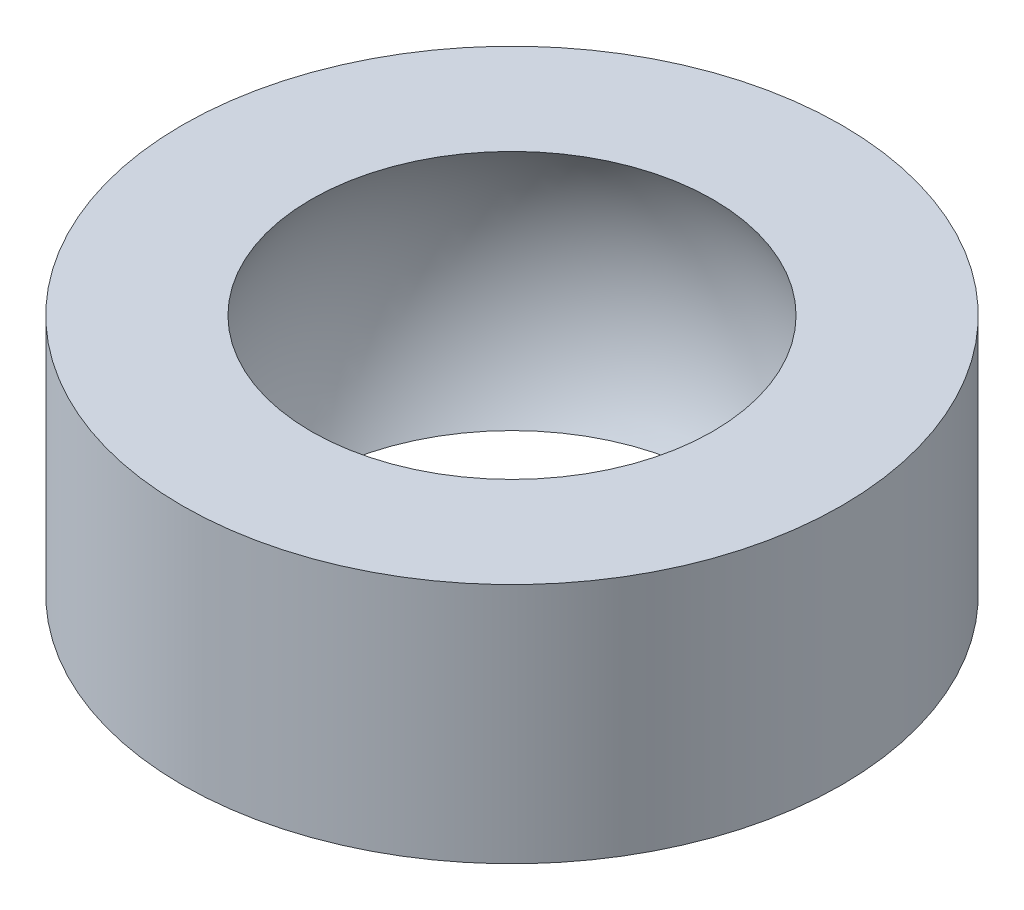
ISO-10303-21;
HEADER;
FILE_DESCRIPTION(('STEP AP214'),'2;1');
FILE_NAME('part.step','',(''),(''),'','','');
FILE_SCHEMA(('AUTOMOTIVE_DESIGN { 1 0 10303 214 1 1 1 1 }'));
ENDSEC;
DATA;
#1=APPLICATION_CONTEXT('core data for automotive mechanical design processes');
#2=APPLICATION_PROTOCOL_DEFINITION('international standard','automotive_design',2000,#1);
#3=PRODUCT_CONTEXT('',#1,'mechanical');
#4=PRODUCT('Part','Part','',(#3));
#5=PRODUCT_RELATED_PRODUCT_CATEGORY('part','',(#4));
#6=PRODUCT_DEFINITION_FORMATION('','',#4);
#7=PRODUCT_DEFINITION_CONTEXT('part definition',#1,'design');
#8=PRODUCT_DEFINITION('design','',#6,#7);
#9=PRODUCT_DEFINITION_SHAPE('','',#8);
#10=(LENGTH_UNIT() NAMED_UNIT(*) SI_UNIT(.MILLI.,.METRE.));
#11=(NAMED_UNIT(*) PLANE_ANGLE_UNIT() SI_UNIT($,.RADIAN.));
#12=(NAMED_UNIT(*) SI_UNIT($,.STERADIAN.) SOLID_ANGLE_UNIT());
#13=UNCERTAINTY_MEASURE_WITH_UNIT(LENGTH_MEASURE(1.E-05),#10,'distance_accuracy_value','');
#14=(GEOMETRIC_REPRESENTATION_CONTEXT(3) GLOBAL_UNCERTAINTY_ASSIGNED_CONTEXT((#13)) GLOBAL_UNIT_ASSIGNED_CONTEXT((#10,
#11,#12)) REPRESENTATION_CONTEXT('',''));
#15=CARTESIAN_POINT('',(0.,0.,0.));
#16=DIRECTION('',(0.,0.,1.));
#17=DIRECTION('',(1.,0.,0.));
#18=AXIS2_PLACEMENT_3D('',#15,#16,#17);
#19=CARTESIAN_POINT('',(0.,3.3,0.));
#20=DIRECTION('',(0.,-1.,0.));
#21=DIRECTION('',(0.,0.,-1.));
#22=AXIS2_PLACEMENT_3D('',#19,#20,#21);
#23=CYLINDRICAL_SURFACE('',#22,9.);
#24=CARTESIAN_POINT('',(0.,3.3,0.));
#25=DIRECTION('',(0.,1.,0.));
#26=DIRECTION('',(0.,0.,1.));
#27=AXIS2_PLACEMENT_3D('',#24,#25,#26);
#28=CIRCLE('',#27,9.);
#29=CARTESIAN_POINT('',(0.,3.3,9.));
#30=VERTEX_POINT('',#29);
#31=EDGE_CURVE('E10',#30,#30,#28,.T.);
#32=ORIENTED_EDGE('',*,*,#31,.F.);
#33=EDGE_LOOP('',(#32));
#34=FACE_BOUND('',#33,.T.);
#35=CARTESIAN_POINT('',(0.,-3.3,0.));
#36=DIRECTION('',(0.,1.,0.));
#37=DIRECTION('',(0.,0.,1.));
#38=AXIS2_PLACEMENT_3D('',#35,#36,#37);
#39=CIRCLE('',#38,9.);
#40=CARTESIAN_POINT('',(0.,-3.3,9.));
#41=VERTEX_POINT('',#40);
#42=EDGE_CURVE('E42',#41,#41,#39,.T.);
#43=ORIENTED_EDGE('',*,*,#42,.T.);
#44=EDGE_LOOP('',(#43));
#45=FACE_BOUND('',#44,.T.);
#46=ADVANCED_FACE('F35',(#34,#45),#23,.T.);
#47=CARTESIAN_POINT('',(0.,3.3,0.));
#48=DIRECTION('',(0.,1.,0.));
#49=DIRECTION('',(0.,0.,1.));
#50=AXIS2_PLACEMENT_3D('',#47,#48,#49);
#51=PLANE('',#50);
#52=CARTESIAN_POINT('',(0.,3.3,0.));
#53=DIRECTION('',(0.,1.,0.));
#54=DIRECTION('',(0.,0.,1.));
#55=AXIS2_PLACEMENT_3D('',#52,#53,#54);
#56=CIRCLE('',#55,5.48361194834208);
#57=CARTESIAN_POINT('',(-5.48361194834208,3.3,0.));
#58=VERTEX_POINT('',#57);
#59=EDGE_CURVE('E47',#58,#58,#56,.T.);
#60=ORIENTED_EDGE('',*,*,#59,.F.);
#61=EDGE_LOOP('',(#60));
#62=FACE_BOUND('',#61,.T.);
#63=ORIENTED_EDGE('',*,*,#31,.T.);
#64=EDGE_LOOP('',(#63));
#65=FACE_BOUND('',#64,.T.);
#66=ADVANCED_FACE('F64',(#62,#65),#51,.T.);
#67=CARTESIAN_POINT('',(0.,-3.3,0.));
#68=DIRECTION('',(0.,1.,0.));
#69=DIRECTION('',(0.,0.,1.));
#70=AXIS2_PLACEMENT_3D('',#67,#68,#69);
#71=PLANE('',#70);
#72=CARTESIAN_POINT('',(0.,-3.3,0.));
#73=DIRECTION('',(0.,1.,0.));
#74=DIRECTION('',(0.,0.,1.));
#75=AXIS2_PLACEMENT_3D('',#72,#73,#74);
#76=CIRCLE('',#75,5.48361194834208);
#77=CARTESIAN_POINT('',(-5.48361194834208,-3.3,0.));
#78=VERTEX_POINT('',#77);
#79=EDGE_CURVE('E38',#78,#78,#76,.T.);
#80=ORIENTED_EDGE('',*,*,#79,.T.);
#81=EDGE_LOOP('',(#80));
#82=FACE_BOUND('',#81,.T.);
#83=ORIENTED_EDGE('',*,*,#42,.F.);
#84=EDGE_LOOP('',(#83));
#85=FACE_BOUND('',#84,.T.);
#86=ADVANCED_FACE('F55',(#82,#85),#71,.F.);
#87=CARTESIAN_POINT('',(0.,0.,0.));
#88=DIRECTION('',(0.,-1.,0.));
#89=DIRECTION('',(-1.,0.,0.));
#90=AXIS2_PLACEMENT_3D('',#87,#88,#89);
#91=SPHERICAL_SURFACE('',#90,6.4);
#92=CARTESIAN_POINT('',(-5.48361194834208,3.3,0.));
#93=CARTESIAN_POINT('',(-5.52085680227095,3.23811118002439,0.));
#94=CARTESIAN_POINT('',(-5.55705305693094,3.17559135466294,0.));
#95=CARTESIAN_POINT('',(-5.62730880796052,3.04936243433516,0.));
#96=CARTESIAN_POINT('',(-5.66136830433011,2.98565333936883,0.));
#97=CARTESIAN_POINT('',(-5.72731097902626,2.85711862099805,0.));
#98=CARTESIAN_POINT('',(-5.75919415735283,2.79229299759362,0.));
#99=CARTESIAN_POINT('',(-5.82074778720863,2.66159960866351,0.));
#100=CARTESIAN_POINT('',(-5.85041823873786,2.59573184313784,0.));
#101=CARTESIAN_POINT('',(-5.90751236682131,2.46302965300479,0.));
#102=CARTESIAN_POINT('',(-5.93493604337552,2.39619522839741,0.));
#103=CARTESIAN_POINT('',(-5.98750519591282,2.26163633744056,0.));
#104=CARTESIAN_POINT('',(-6.0126506718959,2.19391187109109,0.));
#105=CARTESIAN_POINT('',(-6.06063459655309,2.05765052721056,0.));
#106=CARTESIAN_POINT('',(-6.08347304522721,1.9891136496795,0.));
#107=CARTESIAN_POINT('',(-6.12681673643974,1.85130604714006,0.));
#108=CARTESIAN_POINT('',(-6.14732197897817,1.78203532213169,0.));
#109=CARTESIAN_POINT('',(-6.18597575272273,1.64283942904118,0.));
#110=CARTESIAN_POINT('',(-6.20412428392887,1.57291426095905,0.));
#111=CARTESIAN_POINT('',(-6.2380438315356,1.43248963644297,0.));
#112=CARTESIAN_POINT('',(-6.25381484793619,1.36199018000901,0.));
#113=CARTESIAN_POINT('',(-6.2829612877208,1.22049779177738,0.));
#114=CARTESIAN_POINT('',(-6.29633671110481,1.1495048599797,0.));
#115=CARTESIAN_POINT('',(-6.32067663271288,1.00710689968554,0.));
#116=CARTESIAN_POINT('',(-6.33164113093694,0.935701871189058,0.));
#117=CARTESIAN_POINT('',(-6.35114663370242,0.792561568542926,0.));
#118=CARTESIAN_POINT('',(-6.35968763824383,0.72082629439328,0.));
#119=CARTESIAN_POINT('',(-6.37433636315513,0.577107730045273,0.));
#120=CARTESIAN_POINT('',(-6.380444083525,0.505124439846913,0.));
#121=CARTESIAN_POINT('',(-6.39021923885931,0.360992357304671,0.));
#122=CARTESIAN_POINT('',(-6.39388667382373,0.288843564960788,0.));
#123=CARTESIAN_POINT('',(-6.39877705439408,0.144463181744604,0.));
#124=CARTESIAN_POINT('',(-6.4,0.072231590872302,0.));
#125=CARTESIAN_POINT('',(-6.4,-0.072231590872302,0.));
#126=CARTESIAN_POINT('',(-6.39877705439408,-0.144463181744604,0.));
#127=CARTESIAN_POINT('',(-6.39388667382373,-0.288843564960788,0.));
#128=CARTESIAN_POINT('',(-6.39021923885931,-0.360992357304671,0.));
#129=CARTESIAN_POINT('',(-6.380444083525,-0.505124439846913,0.));
#130=CARTESIAN_POINT('',(-6.37433636315513,-0.577107730045273,0.));
#131=CARTESIAN_POINT('',(-6.35968763824383,-0.720826294393279,0.));
#132=CARTESIAN_POINT('',(-6.35114663370242,-0.792561568542926,0.));
#133=CARTESIAN_POINT('',(-6.33164113093694,-0.935701871189058,0.));
#134=CARTESIAN_POINT('',(-6.32067663271288,-1.00710689968554,0.));
#135=CARTESIAN_POINT('',(-6.29633671110481,-1.1495048599797,0.));
#136=CARTESIAN_POINT('',(-6.2829612877208,-1.22049779177738,0.));
#137=CARTESIAN_POINT('',(-6.25381484793619,-1.36199018000901,0.));
#138=CARTESIAN_POINT('',(-6.2380438315356,-1.43248963644297,0.));
#139=CARTESIAN_POINT('',(-6.20412428392887,-1.57291426095905,0.));
#140=CARTESIAN_POINT('',(-6.18597575272273,-1.64283942904118,0.));
#141=CARTESIAN_POINT('',(-6.14732197897817,-1.78203532213169,0.));
#142=CARTESIAN_POINT('',(-6.12681673643974,-1.85130604714006,0.));
#143=CARTESIAN_POINT('',(-6.08347304522721,-1.9891136496795,0.));
#144=CARTESIAN_POINT('',(-6.06063459655309,-2.05765052721056,0.));
#145=CARTESIAN_POINT('',(-6.0126506718959,-2.19391187109109,0.));
#146=CARTESIAN_POINT('',(-5.98750519591282,-2.26163633744056,0.));
#147=CARTESIAN_POINT('',(-5.93493604337552,-2.39619522839741,0.));
#148=CARTESIAN_POINT('',(-5.9075123668213,-2.46302965300479,0.));
#149=CARTESIAN_POINT('',(-5.85041823873786,-2.59573184313784,0.));
#150=CARTESIAN_POINT('',(-5.82074778720863,-2.66159960866351,0.));
#151=CARTESIAN_POINT('',(-5.75919415735283,-2.79229299759362,0.));
#152=CARTESIAN_POINT('',(-5.72731097902626,-2.85711862099805,0.));
#153=CARTESIAN_POINT('',(-5.66136830433011,-2.98565333936883,0.));
#154=CARTESIAN_POINT('',(-5.62730880796051,-3.04936243433516,0.));
#155=CARTESIAN_POINT('',(-5.55705305693094,-3.17559135466294,0.));
#156=CARTESIAN_POINT('',(-5.52085680227095,-3.23811118002439,0.));
#157=CARTESIAN_POINT('',(-5.48361194834208,-3.3,0.));
#158=B_SPLINE_CURVE_WITH_KNOTS('',3,(#92,#93,#94,#95,#96,#97,#98,#99,#100,#101,#102,#103,#104,
#105,#106,#107,#108,#109,#110,#111,#112,#113,#114,#115,#116,#117,#118,#119,#120,#121,#122,#123,
#124,#125,#126,#127,#128,#129,#130,#131,#132,#133,#134,#135,#136,#137,#138,#139,#140,#141,#142,
#143,#144,#145,#146,#147,#148,#149,#150,#151,#152,#153,#154,#155,#156,#157),.UNSPECIFIED.,.F.,
.F.,(4,2,2,2,2,2,2,2,2,2,2,2,2,2,2,2,2,2,2,2,2,2,2,2,2,2,2,2,2,2,2,2,4),(0.,0.216684423542668,
0.433368847085335,0.650053270628003,0.866737694170672,1.08342211771334,1.30010654125601,
1.51679096479868,1.73347538834134,1.95015981188401,2.16684423542668,2.38352865896935,
2.60021308251202,2.81689750605468,3.03358192959735,3.25026635314002,3.46695077668269,
3.68363520022536,3.90031962376802,4.11700404731069,4.33368847085336,4.55037289439603,
4.7670573179387,4.98374174148136,5.20042616502403,5.4171105885667,5.63379501210937,
5.85047943565204,6.0671638591947,6.28384828273737,6.50053270628004,6.71721712982271,
6.93390155336538),.UNSPECIFIED.);
#159=EDGE_CURVE('BSEAM58',#58,#78,#158,.T.);
#160=ORIENTED_EDGE('',*,*,#59,.T.);
#161=ORIENTED_EDGE('',*,*,#79,.F.);
#162=ORIENTED_EDGE('',*,*,#159,.T.);
#163=ORIENTED_EDGE('',*,*,#159,.F.);
#164=EDGE_LOOP('',(#160,#162,#161,#163));
#165=FACE_BOUND('',#164,.T.);
#166=ADVANCED_FACE('F58',(#165),#91,.F.);
#167=CLOSED_SHELL('',(#46,#66,#86,#166));
#168=MANIFOLD_SOLID_BREP('B2',#167);
#169=ADVANCED_BREP_SHAPE_REPRESENTATION('',(#18,#168),#14);
#170=SHAPE_DEFINITION_REPRESENTATION(#9,#169);
ENDSEC;
END-ISO-10303-21;
